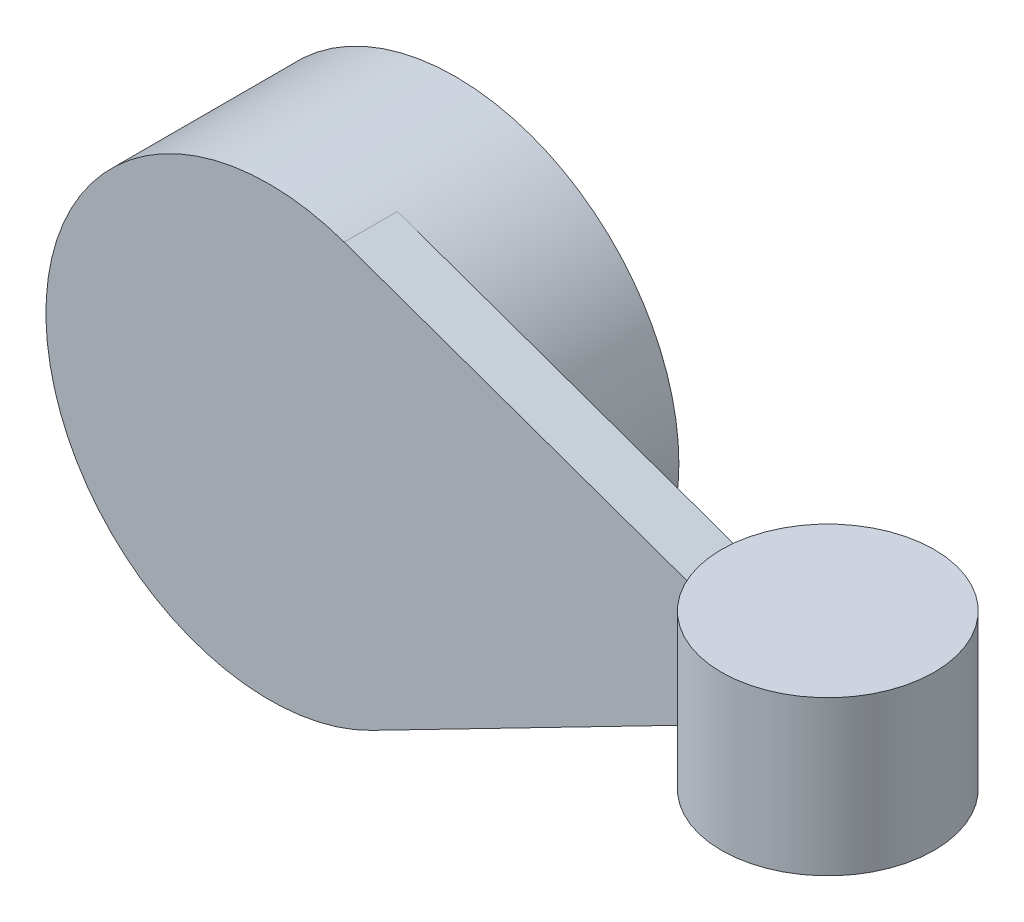
ISO-10303-21;
HEADER;
FILE_DESCRIPTION(('STEP AP214'),'2;1');
FILE_NAME('part.step','',(''),(''),'','','');
FILE_SCHEMA(('AUTOMOTIVE_DESIGN { 1 0 10303 214 1 1 1 1 }'));
ENDSEC;
DATA;
#1=APPLICATION_CONTEXT('core data for automotive mechanical design processes');
#2=APPLICATION_PROTOCOL_DEFINITION('international standard','automotive_design',2000,#1);
#3=PRODUCT_CONTEXT('',#1,'mechanical');
#4=PRODUCT('Part','Part','',(#3));
#5=PRODUCT_RELATED_PRODUCT_CATEGORY('part','',(#4));
#6=PRODUCT_DEFINITION_FORMATION('','',#4);
#7=PRODUCT_DEFINITION_CONTEXT('part definition',#1,'design');
#8=PRODUCT_DEFINITION('design','',#6,#7);
#9=PRODUCT_DEFINITION_SHAPE('','',#8);
#10=(LENGTH_UNIT() NAMED_UNIT(*) SI_UNIT(.MILLI.,.METRE.));
#11=(NAMED_UNIT(*) PLANE_ANGLE_UNIT() SI_UNIT($,.RADIAN.));
#12=(NAMED_UNIT(*) SI_UNIT($,.STERADIAN.) SOLID_ANGLE_UNIT());
#13=UNCERTAINTY_MEASURE_WITH_UNIT(LENGTH_MEASURE(1.E-05),#10,'distance_accuracy_value','');
#14=(GEOMETRIC_REPRESENTATION_CONTEXT(3) GLOBAL_UNCERTAINTY_ASSIGNED_CONTEXT((#13)) GLOBAL_UNIT_ASSIGNED_CONTEXT((#10,
#11,#12)) REPRESENTATION_CONTEXT('',''));
#15=CARTESIAN_POINT('',(0.,0.,0.));
#16=DIRECTION('',(0.,0.,1.));
#17=DIRECTION('',(1.,0.,0.));
#18=AXIS2_PLACEMENT_3D('',#15,#16,#17);
#19=CARTESIAN_POINT('',(19.208719722318,-37.350034626884,35.));
#20=DIRECTION('',(-0.457350469579,0.889286538735333,0.));
#21=DIRECTION('',(-0.889286538735333,-0.457350469579,0.));
#22=AXIS2_PLACEMENT_3D('',#19,#20,#21);
#23=PLANE('',#22);
#24=DIRECTION('',(0.889286538735332,0.457350469579,0.));
#25=VECTOR('',#24,1.);
#26=CARTESIAN_POINT('',(19.208719722318,-37.350034626884,25.));
#27=LINE('',#26,#25);
#28=CARTESIAN_POINT('',(19.208719722318,-37.350034626884,25.));
#29=VERTEX_POINT('',#28);
#30=CARTESIAN_POINT('',(80.6350832689629,-5.75911877591379,25.));
#31=VERTEX_POINT('',#30);
#32=EDGE_CURVE('E113',#29,#31,#27,.T.);
#33=ORIENTED_EDGE('',*,*,#32,.T.);
#34=CARTESIAN_POINT('',(100.,4.20004891023278,30.));
#35=DIRECTION('',(-0.457350469579,0.889286538735333,0.));
#36=DIRECTION('',(0.889286538735333,0.457350469579,0.));
#37=AXIS2_PLACEMENT_3D('',#34,#35,#36);
#38=ELLIPSE('',#37,22.4899389891163,20.);
#39=CARTESIAN_POINT('',(80.6350832689629,-5.7591187759138,35.));
#40=VERTEX_POINT('',#39);
#41=EDGE_CURVE('E58',#31,#40,#38,.T.);
#42=ORIENTED_EDGE('',*,*,#41,.T.);
#43=DIRECTION('',(0.889286538735332,0.457350469579,0.));
#44=VECTOR('',#43,1.);
#45=CARTESIAN_POINT('',(19.208719722318,-37.350034626884,35.));
#46=LINE('',#45,#44);
#47=CARTESIAN_POINT('',(19.208719722318,-37.350034626884,35.));
#48=VERTEX_POINT('',#47);
#49=EDGE_CURVE('E118',#48,#40,#46,.T.);
#50=ORIENTED_EDGE('',*,*,#49,.F.);
#51=DIRECTION('',(0.,0.,-1.));
#52=VECTOR('',#51,1.);
#53=CARTESIAN_POINT('',(19.208719722318,-37.350034626884,35.));
#54=LINE('',#53,#52);
#55=EDGE_CURVE('E125',#48,#29,#54,.T.);
#56=ORIENTED_EDGE('',*,*,#55,.T.);
#57=EDGE_LOOP('',(#33,#42,#50,#56));
#58=FACE_BOUND('',#57,.T.);
#59=ADVANCED_FACE('F35',(#58),#23,.F.);
#60=CARTESIAN_POINT('',(0.,0.,35.));
#61=DIRECTION('',(0.,0.,1.));
#62=DIRECTION('',(1.,0.,0.));
#63=AXIS2_PLACEMENT_3D('',#60,#61,#62);
#64=PLANE('',#63);
#65=DIRECTION('',(0.,1.,0.));
#66=VECTOR('',#65,1.);
#67=CARTESIAN_POINT('',(80.6350832689629,22.7172907254556,35.));
#68=LINE('',#67,#66);
#69=CARTESIAN_POINT('',(80.6350832689629,15.9073805264409,35.));
#70=VERTEX_POINT('',#69);
#71=EDGE_CURVE('E111',#70,#40,#68,.F.);
#72=ORIENTED_EDGE('',*,*,#71,.F.);
#73=DIRECTION('',(-0.942222751750969,0.334986993901005,0.));
#74=VECTOR('',#73,1.);
#75=CARTESIAN_POINT('',(14.0694537438422,39.5733555735407,35.));
#76=LINE('',#75,#74);
#77=CARTESIAN_POINT('',(14.0694537438422,39.5733555735407,35.));
#78=VERTEX_POINT('',#77);
#79=EDGE_CURVE('E150',#70,#78,#76,.T.);
#80=ORIENTED_EDGE('',*,*,#79,.T.);
#81=CARTESIAN_POINT('',(0.,0.,35.));
#82=DIRECTION('',(0.,0.,1.));
#83=DIRECTION('',(1.,0.,0.));
#84=AXIS2_PLACEMENT_3D('',#81,#82,#83);
#85=CIRCLE('',#84,42.);
#86=EDGE_CURVE('E145',#78,#48,#85,.T.);
#87=ORIENTED_EDGE('',*,*,#86,.T.);
#88=ORIENTED_EDGE('',*,*,#49,.T.);
#89=EDGE_LOOP('',(#72,#80,#87,#88));
#90=FACE_BOUND('',#89,.T.);
#91=ADVANCED_FACE('F160',(#90),#64,.T.);
#92=CARTESIAN_POINT('',(0.,0.,25.));
#93=DIRECTION('',(0.,0.,1.));
#94=DIRECTION('',(1.,0.,0.));
#95=AXIS2_PLACEMENT_3D('',#92,#93,#94);
#96=PLANE('',#95);
#97=DIRECTION('',(-0.942222751750969,0.334986993901005,0.));
#98=VECTOR('',#97,1.);
#99=CARTESIAN_POINT('',(14.0694537438422,39.5733555735407,25.));
#100=LINE('',#99,#98);
#101=CARTESIAN_POINT('',(80.6350832689629,15.9073805264409,25.));
#102=VERTEX_POINT('',#101);
#103=CARTESIAN_POINT('',(14.0694537438422,39.5733555735407,25.));
#104=VERTEX_POINT('',#103);
#105=EDGE_CURVE('E110',#102,#104,#100,.T.);
#106=ORIENTED_EDGE('',*,*,#105,.F.);
#107=DIRECTION('',(0.,1.,0.));
#108=VECTOR('',#107,1.);
#109=CARTESIAN_POINT('',(80.6350832689629,22.7172907254556,25.));
#110=LINE('',#109,#108);
#111=EDGE_CURVE('E11',#102,#31,#110,.F.);
#112=ORIENTED_EDGE('',*,*,#111,.T.);
#113=ORIENTED_EDGE('',*,*,#32,.F.);
#114=CARTESIAN_POINT('',(0.,0.,25.));
#115=DIRECTION('',(0.,0.,1.));
#116=DIRECTION('',(1.,0.,0.));
#117=AXIS2_PLACEMENT_3D('',#114,#115,#116);
#118=CIRCLE('',#117,42.);
#119=EDGE_CURVE('E97',#29,#104,#118,.T.);
#120=ORIENTED_EDGE('',*,*,#119,.T.);
#121=EDGE_LOOP('',(#106,#112,#113,#120));
#122=FACE_BOUND('',#121,.T.);
#123=ADVANCED_FACE('F138',(#122),#96,.F.);
#124=CARTESIAN_POINT('',(0.,0.,30.));
#125=DIRECTION('',(0.,0.,-1.));
#126=DIRECTION('',(-1.,0.,0.));
#127=AXIS2_PLACEMENT_3D('',#124,#125,#126);
#128=CYLINDRICAL_SURFACE('',#127,42.);
#129=ORIENTED_EDGE('',*,*,#119,.F.);
#130=ORIENTED_EDGE('',*,*,#55,.F.);
#131=ORIENTED_EDGE('',*,*,#86,.F.);
#132=DIRECTION('',(0.,0.,-1.));
#133=VECTOR('',#132,1.);
#134=CARTESIAN_POINT('',(14.0694537438422,39.5733555735407,35.));
#135=LINE('',#134,#133);
#136=EDGE_CURVE('E127',#78,#104,#135,.T.);
#137=ORIENTED_EDGE('',*,*,#136,.T.);
#138=EDGE_LOOP('',(#129,#130,#131,#137));
#139=FACE_BOUND('',#138,.T.);
#140=CARTESIAN_POINT('',(0.,0.,0.));
#141=DIRECTION('',(0.,0.,1.));
#142=DIRECTION('',(1.,0.,0.));
#143=AXIS2_PLACEMENT_3D('',#140,#141,#142);
#144=CIRCLE('',#143,42.);
#145=CARTESIAN_POINT('',(42.,0.,0.));
#146=VERTEX_POINT('',#145);
#147=EDGE_CURVE('E130',#146,#146,#144,.T.);
#148=ORIENTED_EDGE('',*,*,#147,.T.);
#149=EDGE_LOOP('',(#148));
#150=FACE_BOUND('',#149,.T.);
#151=ADVANCED_FACE('F37',(#139,#150),#128,.T.);
#152=CARTESIAN_POINT('',(0.,0.,0.));
#153=DIRECTION('',(0.,0.,1.));
#154=DIRECTION('',(1.,0.,0.));
#155=AXIS2_PLACEMENT_3D('',#152,#153,#154);
#156=PLANE('',#155);
#157=ORIENTED_EDGE('',*,*,#147,.F.);
#158=EDGE_LOOP('',(#157));
#159=FACE_BOUND('',#158,.T.);
#160=ADVANCED_FACE('F206',(#159),#156,.F.);
#161=CARTESIAN_POINT('',(14.0694537438422,39.5733555735407,35.));
#162=DIRECTION('',(-0.334986993901005,-0.942222751750969,0.));
#163=DIRECTION('',(0.942222751750969,-0.334986993901005,0.));
#164=AXIS2_PLACEMENT_3D('',#161,#162,#163);
#165=PLANE('',#164);
#166=ORIENTED_EDGE('',*,*,#79,.F.);
#167=CARTESIAN_POINT('',(100.,9.02260170867366,30.));
#168=DIRECTION('',(-0.334986993901005,-0.942222751750969,0.));
#169=DIRECTION('',(-0.942222751750969,0.334986993901005,0.));
#170=AXIS2_PLACEMENT_3D('',#167,#168,#169);
#171=ELLIPSE('',#170,21.2264031651042,20.);
#172=EDGE_CURVE('E115',#70,#102,#171,.T.);
#173=ORIENTED_EDGE('',*,*,#172,.T.);
#174=ORIENTED_EDGE('',*,*,#105,.T.);
#175=ORIENTED_EDGE('',*,*,#136,.F.);
#176=EDGE_LOOP('',(#166,#173,#174,#175));
#177=FACE_BOUND('',#176,.T.);
#178=ADVANCED_FACE('F148',(#177),#165,.F.);
#179=CARTESIAN_POINT('',(100.,0.,30.));
#180=DIRECTION('',(0.,1.,0.));
#181=DIRECTION('',(-1.,0.,0.));
#182=AXIS2_PLACEMENT_3D('',#179,#180,#181);
#183=SPHERICAL_SURFACE('',#182,15.);
#184=CARTESIAN_POINT('',(100.,-8.99999999999999,30.));
#185=DIRECTION('',(0.,1.,0.));
#186=DIRECTION('',(0.,0.,1.));
#187=AXIS2_PLACEMENT_3D('',#184,#185,#186);
#188=CIRCLE('',#187,12.);
#189=CARTESIAN_POINT('',(100.,-8.99999999999999,42.));
#190=VERTEX_POINT('',#189);
#191=EDGE_CURVE('E190',#190,#190,#188,.T.);
#192=ORIENTED_EDGE('',*,*,#191,.F.);
#193=EDGE_LOOP('',(#192));
#194=FACE_BOUND('',#193,.T.);
#195=CARTESIAN_POINT('',(86.,0.,30.));
#196=DIRECTION('',(-1.,0.,0.));
#197=DIRECTION('',(0.,0.,1.));
#198=AXIS2_PLACEMENT_3D('',#195,#196,#197);
#199=CIRCLE('',#198,5.38516480713447);
#200=CARTESIAN_POINT('',(86.,-1.9999999999999,35.));
#201=VERTEX_POINT('',#200);
#202=CARTESIAN_POINT('',(86.,-2.99999999999999,34.4721359549995));
#203=VERTEX_POINT('',#202);
#204=EDGE_CURVE('E108',#201,#203,#199,.F.);
#205=ORIENTED_EDGE('',*,*,#204,.F.);
#206=CARTESIAN_POINT('',(100.,0.,35.));
#207=DIRECTION('',(0.,0.,1.));
#208=DIRECTION('',(1.,0.,0.));
#209=AXIS2_PLACEMENT_3D('',#206,#207,#208);
#210=CIRCLE('',#209,14.1421356237309);
#211=CARTESIAN_POINT('',(86.,1.99999999999991,35.));
#212=VERTEX_POINT('',#211);
#213=EDGE_CURVE('E106',#201,#212,#210,.F.);
#214=ORIENTED_EDGE('',*,*,#213,.T.);
#215=CARTESIAN_POINT('',(86.,1.99999999999989,25.));
#216=VERTEX_POINT('',#215);
#217=EDGE_CURVE('E50',#216,#212,#199,.F.);
#218=ORIENTED_EDGE('',*,*,#217,.F.);
#219=CARTESIAN_POINT('',(100.,0.,25.));
#220=DIRECTION('',(0.,0.,1.));
#221=DIRECTION('',(1.,0.,0.));
#222=AXIS2_PLACEMENT_3D('',#219,#220,#221);
#223=CIRCLE('',#222,14.1421356237309);
#224=CARTESIAN_POINT('',(86.,-1.99999999999989,25.));
#225=VERTEX_POINT('',#224);
#226=EDGE_CURVE('E43',#225,#216,#223,.F.);
#227=ORIENTED_EDGE('',*,*,#226,.F.);
#228=CARTESIAN_POINT('',(86.,-3.,25.5278640450005));
#229=VERTEX_POINT('',#228);
#230=EDGE_CURVE('E92',#229,#225,#199,.F.);
#231=ORIENTED_EDGE('',*,*,#230,.F.);
#232=CARTESIAN_POINT('',(98.2917745199048,3.32152698120484,30.));
#233=DIRECTION('',(-0.457350469579,0.889286538735333,0.));
#234=DIRECTION('',(-0.889286538735333,-0.457350469579,0.));
#235=AXIS2_PLACEMENT_3D('',#232,#233,#234);
#236=CIRCLE('',#235,14.5275401986118);
#237=EDGE_CURVE('E181',#203,#229,#236,.F.);
#238=ORIENTED_EDGE('',*,*,#237,.F.);
#239=EDGE_LOOP('',(#205,#214,#218,#227,#231,#238));
#240=FACE_BOUND('',#239,.T.);
#241=ADVANCED_FACE('F91',(#194,#240),#183,.F.);
#242=CARTESIAN_POINT('',(80.,20.,30.));
#243=DIRECTION('',(0.,1.,0.));
#244=DIRECTION('',(0.,0.,1.));
#245=AXIS2_PLACEMENT_3D('',#242,#243,#244);
#246=PLANE('',#245);
#247=CARTESIAN_POINT('',(100.,20.,30.));
#248=DIRECTION('',(0.,1.,0.));
#249=DIRECTION('',(0.,0.,1.));
#250=AXIS2_PLACEMENT_3D('',#247,#248,#249);
#251=CIRCLE('',#250,20.);
#252=CARTESIAN_POINT('',(100.,20.,50.));
#253=VERTEX_POINT('',#252);
#254=EDGE_CURVE('E184',#253,#253,#251,.T.);
#255=ORIENTED_EDGE('',*,*,#254,.T.);
#256=EDGE_LOOP('',(#255));
#257=FACE_BOUND('',#256,.T.);
#258=ADVANCED_FACE('F197',(#257),#246,.T.);
#259=CARTESIAN_POINT('',(100.,22.7172907254556,30.));
#260=DIRECTION('',(0.,1.,0.));
#261=DIRECTION('',(0.,0.,1.));
#262=AXIS2_PLACEMENT_3D('',#259,#260,#261);
#263=CYLINDRICAL_SURFACE('',#262,20.);
#264=ORIENTED_EDGE('',*,*,#172,.F.);
#265=ORIENTED_EDGE('',*,*,#71,.T.);
#266=ORIENTED_EDGE('',*,*,#41,.F.);
#267=ORIENTED_EDGE('',*,*,#111,.F.);
#268=EDGE_LOOP('',(#264,#265,#266,#267));
#269=FACE_BOUND('',#268,.T.);
#270=CARTESIAN_POINT('',(100.,-9.,30.));
#271=DIRECTION('',(0.,1.,0.));
#272=DIRECTION('',(0.,0.,1.));
#273=AXIS2_PLACEMENT_3D('',#270,#271,#272);
#274=CIRCLE('',#273,20.);
#275=CARTESIAN_POINT('',(100.,-9.,50.));
#276=VERTEX_POINT('',#275);
#277=EDGE_CURVE('E187',#276,#276,#274,.T.);
#278=ORIENTED_EDGE('',*,*,#277,.T.);
#279=EDGE_LOOP('',(#278));
#280=FACE_BOUND('',#279,.T.);
#281=ORIENTED_EDGE('',*,*,#254,.F.);
#282=EDGE_LOOP('',(#281));
#283=FACE_BOUND('',#282,.T.);
#284=ADVANCED_FACE('F203',(#269,#280,#283),#263,.T.);
#285=CARTESIAN_POINT('',(80.,-9.,30.));
#286=DIRECTION('',(0.,-1.,0.));
#287=DIRECTION('',(0.,0.,-1.));
#288=AXIS2_PLACEMENT_3D('',#285,#286,#287);
#289=PLANE('',#288);
#290=ORIENTED_EDGE('',*,*,#191,.T.);
#291=EDGE_LOOP('',(#290));
#292=FACE_BOUND('',#291,.T.);
#293=ORIENTED_EDGE('',*,*,#277,.F.);
#294=EDGE_LOOP('',(#293));
#295=FACE_BOUND('',#294,.T.);
#296=ADVANCED_FACE('F180',(#292,#295),#289,.T.);
#297=DIRECTION('',(0.,1.,0.));
#298=VECTOR('',#297,1.);
#299=CARTESIAN_POINT('',(86.,14.,25.));
#300=LINE('',#299,#298);
#301=EDGE_CURVE('E102',#225,#216,#300,.T.);
#302=ORIENTED_EDGE('',*,*,#301,.F.);
#303=ORIENTED_EDGE('',*,*,#226,.T.);
#304=EDGE_LOOP('',(#302,#303));
#305=FACE_BOUND('',#304,.T.);
#306=ADVANCED_FACE('F109',(#305),#96,.F.);
#307=DIRECTION('',(0.,0.,-1.));
#308=VECTOR('',#307,1.);
#309=CARTESIAN_POINT('',(86.,-3.,35.));
#310=LINE('',#309,#308);
#311=EDGE_CURVE('E105',#203,#229,#310,.T.);
#312=ORIENTED_EDGE('',*,*,#311,.F.);
#313=ORIENTED_EDGE('',*,*,#237,.T.);
#314=EDGE_LOOP('',(#312,#313));
#315=FACE_BOUND('',#314,.T.);
#316=ADVANCED_FACE('F164',(#315),#23,.F.);
#317=ORIENTED_EDGE('',*,*,#213,.F.);
#318=DIRECTION('',(0.,1.,0.));
#319=VECTOR('',#318,1.);
#320=CARTESIAN_POINT('',(86.,14.,35.));
#321=LINE('',#320,#319);
#322=EDGE_CURVE('E123',#201,#212,#321,.T.);
#323=ORIENTED_EDGE('',*,*,#322,.T.);
#324=EDGE_LOOP('',(#317,#323));
#325=FACE_BOUND('',#324,.T.);
#326=ADVANCED_FACE('F170',(#325),#64,.T.);
#327=CARTESIAN_POINT('',(86.,14.,35.));
#328=DIRECTION('',(-1.,0.,0.));
#329=DIRECTION('',(0.,0.,1.));
#330=AXIS2_PLACEMENT_3D('',#327,#328,#329);
#331=PLANE('',#330);
#332=ORIENTED_EDGE('',*,*,#322,.F.);
#333=ORIENTED_EDGE('',*,*,#204,.T.);
#334=ORIENTED_EDGE('',*,*,#311,.T.);
#335=ORIENTED_EDGE('',*,*,#230,.T.);
#336=ORIENTED_EDGE('',*,*,#301,.T.);
#337=ORIENTED_EDGE('',*,*,#217,.T.);
#338=EDGE_LOOP('',(#332,#333,#334,#335,#336,#337));
#339=FACE_BOUND('',#338,.T.);
#340=ADVANCED_FACE('F101',(#339),#331,.F.);
#341=CLOSED_SHELL('',(#59,#91,#123,#151,#160,#178,#241,#258,#284,#296,#306,#316,#326,#340));
#342=MANIFOLD_SOLID_BREP('B2',#341);
#343=ADVANCED_BREP_SHAPE_REPRESENTATION('',(#18,#342),#14);
#344=SHAPE_DEFINITION_REPRESENTATION(#9,#343);
ENDSEC;
END-ISO-10303-21;
